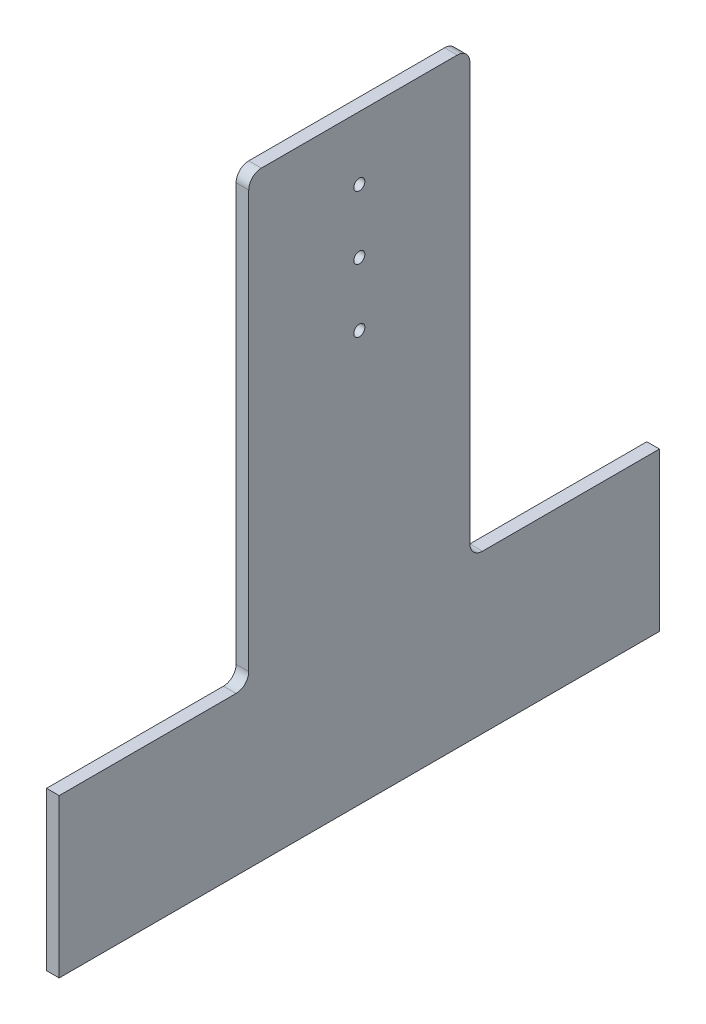
ISO-10303-21;
HEADER;
FILE_DESCRIPTION(('STEP AP214'),'2;1');
FILE_NAME('part.step','',(''),(''),'','','');
FILE_SCHEMA(('AUTOMOTIVE_DESIGN { 1 0 10303 214 1 1 1 1 }'));
ENDSEC;
DATA;
#1=APPLICATION_CONTEXT('core data for automotive mechanical design processes');
#2=APPLICATION_PROTOCOL_DEFINITION('international standard','automotive_design',2000,#1);
#3=PRODUCT_CONTEXT('',#1,'mechanical');
#4=PRODUCT('Part','Part','',(#3));
#5=PRODUCT_RELATED_PRODUCT_CATEGORY('part','',(#4));
#6=PRODUCT_DEFINITION_FORMATION('','',#4);
#7=PRODUCT_DEFINITION_CONTEXT('part definition',#1,'design');
#8=PRODUCT_DEFINITION('design','',#6,#7);
#9=PRODUCT_DEFINITION_SHAPE('','',#8);
#10=(LENGTH_UNIT() NAMED_UNIT(*) SI_UNIT(.MILLI.,.METRE.));
#11=(NAMED_UNIT(*) PLANE_ANGLE_UNIT() SI_UNIT($,.RADIAN.));
#12=(NAMED_UNIT(*) SI_UNIT($,.STERADIAN.) SOLID_ANGLE_UNIT());
#13=UNCERTAINTY_MEASURE_WITH_UNIT(LENGTH_MEASURE(1.E-05),#10,'distance_accuracy_value','');
#14=(GEOMETRIC_REPRESENTATION_CONTEXT(3) GLOBAL_UNCERTAINTY_ASSIGNED_CONTEXT((#13)) GLOBAL_UNIT_ASSIGNED_CONTEXT((#10,
#11,#12)) REPRESENTATION_CONTEXT('',''));
#15=CARTESIAN_POINT('',(0.,0.,0.));
#16=DIRECTION('',(0.,0.,1.));
#17=DIRECTION('',(1.,0.,0.));
#18=AXIS2_PLACEMENT_3D('',#15,#16,#17);
#19=CARTESIAN_POINT('',(4.,0.,0.));
#20=DIRECTION('',(1.,0.,0.));
#21=DIRECTION('',(0.,0.,-1.));
#22=AXIS2_PLACEMENT_3D('',#19,#20,#21);
#23=PLANE('',#22);
#24=CARTESIAN_POINT('',(4.,125.,-2.22142021339255E-13));
#25=DIRECTION('',(1.,0.,0.));
#26=DIRECTION('',(0.,0.,-1.));
#27=AXIS2_PLACEMENT_3D('',#24,#25,#26);
#28=CIRCLE('',#27,1.75);
#29=CARTESIAN_POINT('',(4.,125.,-1.75000000000022));
#30=VERTEX_POINT('',#29);
#31=EDGE_CURVE('E294',#30,#30,#28,.T.);
#32=ORIENTED_EDGE('',*,*,#31,.F.);
#33=EDGE_LOOP('',(#32));
#34=FACE_BOUND('',#33,.T.);
#35=DIRECTION('',(0.,1.,0.));
#36=VECTOR('',#35,1.);
#37=CARTESIAN_POINT('',(4.,165.,-35.));
#38=LINE('',#37,#36);
#39=CARTESIAN_POINT('',(4.,29.,-35.));
#40=VERTEX_POINT('',#39);
#41=CARTESIAN_POINT('',(4.,161.,-35.));
#42=VERTEX_POINT('',#41);
#43=EDGE_CURVE('E143',#40,#42,#38,.T.);
#44=ORIENTED_EDGE('',*,*,#43,.T.);
#45=CARTESIAN_POINT('',(4.,161.,-31.));
#46=DIRECTION('',(1.,0.,0.));
#47=DIRECTION('',(0.,0.,-1.));
#48=AXIS2_PLACEMENT_3D('',#45,#46,#47);
#49=CIRCLE('',#48,4.);
#50=CARTESIAN_POINT('',(4.,165.,-31.));
#51=VERTEX_POINT('',#50);
#52=EDGE_CURVE('E194',#42,#51,#49,.T.);
#53=ORIENTED_EDGE('',*,*,#52,.T.);
#54=DIRECTION('',(0.,0.,1.));
#55=VECTOR('',#54,1.);
#56=CARTESIAN_POINT('',(4.,165.,35.));
#57=LINE('',#56,#55);
#58=CARTESIAN_POINT('',(4.,165.,31.));
#59=VERTEX_POINT('',#58);
#60=EDGE_CURVE('E241',#51,#59,#57,.T.);
#61=ORIENTED_EDGE('',*,*,#60,.T.);
#62=CARTESIAN_POINT('',(4.,161.,31.));
#63=DIRECTION('',(1.,0.,0.));
#64=DIRECTION('',(0.,0.,-1.));
#65=AXIS2_PLACEMENT_3D('',#62,#63,#64);
#66=CIRCLE('',#65,4.);
#67=CARTESIAN_POINT('',(4.,161.,35.));
#68=VERTEX_POINT('',#67);
#69=EDGE_CURVE('E191',#59,#68,#66,.T.);
#70=ORIENTED_EDGE('',*,*,#69,.T.);
#71=DIRECTION('',(0.,-1.,0.));
#72=VECTOR('',#71,1.);
#73=CARTESIAN_POINT('',(4.,165.,35.));
#74=LINE('',#73,#72);
#75=CARTESIAN_POINT('',(4.,29.,35.));
#76=VERTEX_POINT('',#75);
#77=EDGE_CURVE('E236',#68,#76,#74,.T.);
#78=ORIENTED_EDGE('',*,*,#77,.T.);
#79=CARTESIAN_POINT('',(4.,29.,39.));
#80=DIRECTION('',(1.,0.,0.));
#81=DIRECTION('',(0.,0.,-1.));
#82=AXIS2_PLACEMENT_3D('',#79,#80,#81);
#83=CIRCLE('',#82,4.);
#84=CARTESIAN_POINT('',(4.,25.,39.));
#85=VERTEX_POINT('',#84);
#86=EDGE_CURVE('E11',#76,#85,#83,.F.);
#87=ORIENTED_EDGE('',*,*,#86,.T.);
#88=DIRECTION('',(0.,0.,1.));
#89=VECTOR('',#88,1.);
#90=CARTESIAN_POINT('',(4.,25.,94.9999999999999));
#91=LINE('',#90,#89);
#92=CARTESIAN_POINT('',(4.,25.,94.9999999999999));
#93=VERTEX_POINT('',#92);
#94=EDGE_CURVE('E232',#85,#93,#91,.T.);
#95=ORIENTED_EDGE('',*,*,#94,.T.);
#96=DIRECTION('',(0.,-1.,0.));
#97=VECTOR('',#96,1.);
#98=CARTESIAN_POINT('',(4.,25.,94.9999999999999));
#99=LINE('',#98,#97);
#100=CARTESIAN_POINT('',(4.,-25.,94.9999999999999));
#101=VERTEX_POINT('',#100);
#102=EDGE_CURVE('E235',#93,#101,#99,.T.);
#103=ORIENTED_EDGE('',*,*,#102,.T.);
#104=DIRECTION('',(0.,0.,-1.));
#105=VECTOR('',#104,1.);
#106=CARTESIAN_POINT('',(4.,-25.,94.9999999999999));
#107=LINE('',#106,#105);
#108=CARTESIAN_POINT('',(4.,-25.,-95.0000000000001));
#109=VERTEX_POINT('',#108);
#110=EDGE_CURVE('E150',#101,#109,#107,.T.);
#111=ORIENTED_EDGE('',*,*,#110,.T.);
#112=DIRECTION('',(0.,1.,0.));
#113=VECTOR('',#112,1.);
#114=CARTESIAN_POINT('',(4.,25.,-95.0000000000001));
#115=LINE('',#114,#113);
#116=CARTESIAN_POINT('',(4.,25.,-95.0000000000001));
#117=VERTEX_POINT('',#116);
#118=EDGE_CURVE('E144',#109,#117,#115,.T.);
#119=ORIENTED_EDGE('',*,*,#118,.T.);
#120=DIRECTION('',(0.,0.,1.));
#121=VECTOR('',#120,1.);
#122=CARTESIAN_POINT('',(4.,25.,-35.));
#123=LINE('',#122,#121);
#124=CARTESIAN_POINT('',(4.,25.,-39.));
#125=VERTEX_POINT('',#124);
#126=EDGE_CURVE('E132',#117,#125,#123,.T.);
#127=ORIENTED_EDGE('',*,*,#126,.T.);
#128=CARTESIAN_POINT('',(4.,29.,-39.));
#129=DIRECTION('',(1.,0.,0.));
#130=DIRECTION('',(0.,0.,-1.));
#131=AXIS2_PLACEMENT_3D('',#128,#129,#130);
#132=CIRCLE('',#131,4.);
#133=EDGE_CURVE('E210',#125,#40,#132,.F.);
#134=ORIENTED_EDGE('',*,*,#133,.T.);
#135=EDGE_LOOP('',(#44,#53,#61,#70,#78,#87,#95,#103,#111,#119,#127,#134));
#136=FACE_BOUND('',#135,.T.);
#137=CARTESIAN_POINT('',(4.,145.,0.));
#138=DIRECTION('',(1.,0.,0.));
#139=DIRECTION('',(0.,0.,-1.));
#140=AXIS2_PLACEMENT_3D('',#137,#138,#139);
#141=CIRCLE('',#140,1.75);
#142=CARTESIAN_POINT('',(4.,145.,-1.75000000000001));
#143=VERTEX_POINT('',#142);
#144=EDGE_CURVE('E251',#143,#143,#141,.T.);
#145=ORIENTED_EDGE('',*,*,#144,.F.);
#146=EDGE_LOOP('',(#145));
#147=FACE_BOUND('',#146,.T.);
#148=CARTESIAN_POINT('',(4.,105.,-4.30406254870696E-13));
#149=DIRECTION('',(1.,0.,0.));
#150=DIRECTION('',(0.,0.,-1.));
#151=AXIS2_PLACEMENT_3D('',#148,#149,#150);
#152=CIRCLE('',#151,1.75);
#153=CARTESIAN_POINT('',(4.,105.,-1.75000000000043));
#154=VERTEX_POINT('',#153);
#155=EDGE_CURVE('E302',#154,#154,#152,.T.);
#156=ORIENTED_EDGE('',*,*,#155,.F.);
#157=EDGE_LOOP('',(#156));
#158=FACE_BOUND('',#157,.T.);
#159=ADVANCED_FACE('F42',(#34,#136,#147,#158),#23,.T.);
#160=CARTESIAN_POINT('',(0.,0.,0.));
#161=DIRECTION('',(1.,0.,0.));
#162=DIRECTION('',(0.,0.,-1.));
#163=AXIS2_PLACEMENT_3D('',#160,#161,#162);
#164=PLANE('',#163);
#165=DIRECTION('',(0.,0.,1.));
#166=VECTOR('',#165,1.);
#167=CARTESIAN_POINT('',(0.,165.,35.));
#168=LINE('',#167,#166);
#169=CARTESIAN_POINT('',(0.,165.,-31.));
#170=VERTEX_POINT('',#169);
#171=CARTESIAN_POINT('',(0.,165.,31.));
#172=VERTEX_POINT('',#171);
#173=EDGE_CURVE('E227',#170,#172,#168,.T.);
#174=ORIENTED_EDGE('',*,*,#173,.F.);
#175=CARTESIAN_POINT('',(0.,161.,-31.));
#176=DIRECTION('',(1.,0.,0.));
#177=DIRECTION('',(0.,0.,-1.));
#178=AXIS2_PLACEMENT_3D('',#175,#176,#177);
#179=CIRCLE('',#178,4.);
#180=CARTESIAN_POINT('',(0.,161.,-35.));
#181=VERTEX_POINT('',#180);
#182=EDGE_CURVE('E188',#170,#181,#179,.F.);
#183=ORIENTED_EDGE('',*,*,#182,.T.);
#184=DIRECTION('',(0.,1.,0.));
#185=VECTOR('',#184,1.);
#186=CARTESIAN_POINT('',(0.,165.,-35.));
#187=LINE('',#186,#185);
#188=CARTESIAN_POINT('',(0.,29.,-35.));
#189=VERTEX_POINT('',#188);
#190=EDGE_CURVE('E254',#189,#181,#187,.T.);
#191=ORIENTED_EDGE('',*,*,#190,.F.);
#192=CARTESIAN_POINT('',(0.,29.,-39.));
#193=DIRECTION('',(1.,0.,0.));
#194=DIRECTION('',(0.,0.,-1.));
#195=AXIS2_PLACEMENT_3D('',#192,#193,#194);
#196=CIRCLE('',#195,4.);
#197=CARTESIAN_POINT('',(0.,25.,-39.));
#198=VERTEX_POINT('',#197);
#199=EDGE_CURVE('E207',#189,#198,#196,.T.);
#200=ORIENTED_EDGE('',*,*,#199,.T.);
#201=DIRECTION('',(0.,0.,1.));
#202=VECTOR('',#201,1.);
#203=CARTESIAN_POINT('',(0.,25.,-35.));
#204=LINE('',#203,#202);
#205=CARTESIAN_POINT('',(0.,25.,-95.0000000000001));
#206=VERTEX_POINT('',#205);
#207=EDGE_CURVE('E250',#206,#198,#204,.T.);
#208=ORIENTED_EDGE('',*,*,#207,.F.);
#209=DIRECTION('',(0.,1.,0.));
#210=VECTOR('',#209,1.);
#211=CARTESIAN_POINT('',(0.,25.,-95.0000000000001));
#212=LINE('',#211,#210);
#213=CARTESIAN_POINT('',(0.,-25.,-95.0000000000001));
#214=VERTEX_POINT('',#213);
#215=EDGE_CURVE('E159',#214,#206,#212,.T.);
#216=ORIENTED_EDGE('',*,*,#215,.F.);
#217=DIRECTION('',(0.,0.,-1.));
#218=VECTOR('',#217,1.);
#219=CARTESIAN_POINT('',(0.,-25.,94.9999999999999));
#220=LINE('',#219,#218);
#221=CARTESIAN_POINT('',(0.,-25.,94.9999999999999));
#222=VERTEX_POINT('',#221);
#223=EDGE_CURVE('E155',#222,#214,#220,.T.);
#224=ORIENTED_EDGE('',*,*,#223,.F.);
#225=DIRECTION('',(0.,-1.,0.));
#226=VECTOR('',#225,1.);
#227=CARTESIAN_POINT('',(0.,25.,94.9999999999999));
#228=LINE('',#227,#226);
#229=CARTESIAN_POINT('',(0.,25.,94.9999999999999));
#230=VERTEX_POINT('',#229);
#231=EDGE_CURVE('E263',#230,#222,#228,.T.);
#232=ORIENTED_EDGE('',*,*,#231,.F.);
#233=DIRECTION('',(0.,0.,1.));
#234=VECTOR('',#233,1.);
#235=CARTESIAN_POINT('',(0.,25.,94.9999999999999));
#236=LINE('',#235,#234);
#237=CARTESIAN_POINT('',(0.,25.,39.));
#238=VERTEX_POINT('',#237);
#239=EDGE_CURVE('E221',#238,#230,#236,.T.);
#240=ORIENTED_EDGE('',*,*,#239,.F.);
#241=CARTESIAN_POINT('',(0.,29.,39.));
#242=DIRECTION('',(1.,0.,0.));
#243=DIRECTION('',(0.,0.,-1.));
#244=AXIS2_PLACEMENT_3D('',#241,#242,#243);
#245=CIRCLE('',#244,4.);
#246=CARTESIAN_POINT('',(0.,29.,35.));
#247=VERTEX_POINT('',#246);
#248=EDGE_CURVE('E51',#238,#247,#245,.T.);
#249=ORIENTED_EDGE('',*,*,#248,.T.);
#250=DIRECTION('',(0.,-1.,0.));
#251=VECTOR('',#250,1.);
#252=CARTESIAN_POINT('',(0.,165.,35.));
#253=LINE('',#252,#251);
#254=CARTESIAN_POINT('',(0.,161.,35.));
#255=VERTEX_POINT('',#254);
#256=EDGE_CURVE('E219',#255,#247,#253,.T.);
#257=ORIENTED_EDGE('',*,*,#256,.F.);
#258=CARTESIAN_POINT('',(0.,161.,31.));
#259=DIRECTION('',(1.,0.,0.));
#260=DIRECTION('',(0.,0.,-1.));
#261=AXIS2_PLACEMENT_3D('',#258,#259,#260);
#262=CIRCLE('',#261,4.);
#263=EDGE_CURVE('E185',#255,#172,#262,.F.);
#264=ORIENTED_EDGE('',*,*,#263,.T.);
#265=EDGE_LOOP('',(#174,#183,#191,#200,#208,#216,#224,#232,#240,#249,#257,#264));
#266=FACE_BOUND('',#265,.T.);
#267=CARTESIAN_POINT('',(0.,145.,0.));
#268=DIRECTION('',(1.,0.,0.));
#269=DIRECTION('',(0.,0.,-1.));
#270=AXIS2_PLACEMENT_3D('',#267,#268,#269);
#271=CIRCLE('',#270,1.75);
#272=CARTESIAN_POINT('',(0.,145.,-1.75000000000001));
#273=VERTEX_POINT('',#272);
#274=EDGE_CURVE('E290',#273,#273,#271,.T.);
#275=ORIENTED_EDGE('',*,*,#274,.T.);
#276=EDGE_LOOP('',(#275));
#277=FACE_BOUND('',#276,.T.);
#278=CARTESIAN_POINT('',(0.,125.,-2.22142021339255E-13));
#279=DIRECTION('',(1.,0.,0.));
#280=DIRECTION('',(0.,0.,-1.));
#281=AXIS2_PLACEMENT_3D('',#278,#279,#280);
#282=CIRCLE('',#281,1.75);
#283=CARTESIAN_POINT('',(0.,125.,-1.75000000000022));
#284=VERTEX_POINT('',#283);
#285=EDGE_CURVE('E298',#284,#284,#282,.T.);
#286=ORIENTED_EDGE('',*,*,#285,.T.);
#287=EDGE_LOOP('',(#286));
#288=FACE_BOUND('',#287,.T.);
#289=CARTESIAN_POINT('',(0.,105.,-4.30406254870696E-13));
#290=DIRECTION('',(1.,0.,0.));
#291=DIRECTION('',(0.,0.,-1.));
#292=AXIS2_PLACEMENT_3D('',#289,#290,#291);
#293=CIRCLE('',#292,1.75);
#294=CARTESIAN_POINT('',(0.,105.,-1.75000000000043));
#295=VERTEX_POINT('',#294);
#296=EDGE_CURVE('E306',#295,#295,#293,.T.);
#297=ORIENTED_EDGE('',*,*,#296,.T.);
#298=EDGE_LOOP('',(#297));
#299=FACE_BOUND('',#298,.T.);
#300=ADVANCED_FACE('F217',(#266,#277,#288,#299),#164,.F.);
#301=CARTESIAN_POINT('',(4.,25.,-95.0000000000001));
#302=DIRECTION('',(0.,0.,1.));
#303=DIRECTION('',(1.,0.,0.));
#304=AXIS2_PLACEMENT_3D('',#301,#302,#303);
#305=PLANE('',#304);
#306=ORIENTED_EDGE('',*,*,#215,.T.);
#307=DIRECTION('',(-1.,0.,0.));
#308=VECTOR('',#307,1.);
#309=CARTESIAN_POINT('',(4.,25.,-95.0000000000001));
#310=LINE('',#309,#308);
#311=EDGE_CURVE('E137',#117,#206,#310,.T.);
#312=ORIENTED_EDGE('',*,*,#311,.F.);
#313=ORIENTED_EDGE('',*,*,#118,.F.);
#314=DIRECTION('',(-1.,0.,0.));
#315=VECTOR('',#314,1.);
#316=CARTESIAN_POINT('',(4.,-25.,-95.0000000000001));
#317=LINE('',#316,#315);
#318=EDGE_CURVE('E247',#109,#214,#317,.T.);
#319=ORIENTED_EDGE('',*,*,#318,.T.);
#320=EDGE_LOOP('',(#306,#312,#313,#319));
#321=FACE_BOUND('',#320,.T.);
#322=ADVANCED_FACE('F157',(#321),#305,.F.);
#323=CARTESIAN_POINT('',(4.,25.,-35.));
#324=DIRECTION('',(0.,-1.,0.));
#325=DIRECTION('',(0.,0.,-1.));
#326=AXIS2_PLACEMENT_3D('',#323,#324,#325);
#327=PLANE('',#326);
#328=ORIENTED_EDGE('',*,*,#207,.T.);
#329=DIRECTION('',(-1.,0.,0.));
#330=VECTOR('',#329,1.);
#331=CARTESIAN_POINT('',(4.,25.,-39.));
#332=LINE('',#331,#330);
#333=EDGE_CURVE('E140',#198,#125,#332,.F.);
#334=ORIENTED_EDGE('',*,*,#333,.T.);
#335=ORIENTED_EDGE('',*,*,#126,.F.);
#336=ORIENTED_EDGE('',*,*,#311,.T.);
#337=EDGE_LOOP('',(#328,#334,#335,#336));
#338=FACE_BOUND('',#337,.T.);
#339=ADVANCED_FACE('F135',(#338),#327,.F.);
#340=CARTESIAN_POINT('',(4.,165.,-35.));
#341=DIRECTION('',(0.,0.,1.));
#342=DIRECTION('',(0.,-1.,0.));
#343=AXIS2_PLACEMENT_3D('',#340,#341,#342);
#344=PLANE('',#343);
#345=ORIENTED_EDGE('',*,*,#43,.F.);
#346=DIRECTION('',(-1.,0.,0.));
#347=VECTOR('',#346,1.);
#348=CARTESIAN_POINT('',(0.,29.,-35.));
#349=LINE('',#348,#347);
#350=EDGE_CURVE('E166',#40,#189,#349,.T.);
#351=ORIENTED_EDGE('',*,*,#350,.T.);
#352=ORIENTED_EDGE('',*,*,#190,.T.);
#353=DIRECTION('',(-1.,0.,0.));
#354=VECTOR('',#353,1.);
#355=CARTESIAN_POINT('',(4.,161.,-35.));
#356=LINE('',#355,#354);
#357=EDGE_CURVE('E161',#181,#42,#356,.F.);
#358=ORIENTED_EDGE('',*,*,#357,.T.);
#359=EDGE_LOOP('',(#345,#351,#352,#358));
#360=FACE_BOUND('',#359,.T.);
#361=ADVANCED_FACE('F283',(#360),#344,.F.);
#362=CARTESIAN_POINT('',(4.,165.,35.));
#363=DIRECTION('',(0.,-1.,0.));
#364=DIRECTION('',(0.,0.,-1.));
#365=AXIS2_PLACEMENT_3D('',#362,#363,#364);
#366=PLANE('',#365);
#367=ORIENTED_EDGE('',*,*,#60,.F.);
#368=DIRECTION('',(-1.,0.,0.));
#369=VECTOR('',#368,1.);
#370=CARTESIAN_POINT('',(4.,165.,-31.));
#371=LINE('',#370,#369);
#372=EDGE_CURVE('E181',#51,#170,#371,.T.);
#373=ORIENTED_EDGE('',*,*,#372,.T.);
#374=ORIENTED_EDGE('',*,*,#173,.T.);
#375=DIRECTION('',(-1.,0.,0.));
#376=VECTOR('',#375,1.);
#377=CARTESIAN_POINT('',(4.,165.,31.));
#378=LINE('',#377,#376);
#379=EDGE_CURVE('E178',#172,#59,#378,.F.);
#380=ORIENTED_EDGE('',*,*,#379,.T.);
#381=EDGE_LOOP('',(#367,#373,#374,#380));
#382=FACE_BOUND('',#381,.T.);
#383=ADVANCED_FACE('F338',(#382),#366,.F.);
#384=CARTESIAN_POINT('',(4.,165.,35.));
#385=DIRECTION('',(0.,0.,-1.));
#386=DIRECTION('',(0.,1.,0.));
#387=AXIS2_PLACEMENT_3D('',#384,#385,#386);
#388=PLANE('',#387);
#389=ORIENTED_EDGE('',*,*,#77,.F.);
#390=DIRECTION('',(-1.,0.,0.));
#391=VECTOR('',#390,1.);
#392=CARTESIAN_POINT('',(4.,161.,35.));
#393=LINE('',#392,#391);
#394=EDGE_CURVE('E199',#68,#255,#393,.T.);
#395=ORIENTED_EDGE('',*,*,#394,.T.);
#396=ORIENTED_EDGE('',*,*,#256,.T.);
#397=DIRECTION('',(-1.,0.,0.));
#398=VECTOR('',#397,1.);
#399=CARTESIAN_POINT('',(4.,29.,35.));
#400=LINE('',#399,#398);
#401=EDGE_CURVE('E64',#247,#76,#400,.F.);
#402=ORIENTED_EDGE('',*,*,#401,.T.);
#403=EDGE_LOOP('',(#389,#395,#396,#402));
#404=FACE_BOUND('',#403,.T.);
#405=ADVANCED_FACE('F224',(#404),#388,.F.);
#406=CARTESIAN_POINT('',(4.,25.,94.9999999999999));
#407=DIRECTION('',(0.,-1.,0.));
#408=DIRECTION('',(0.,0.,-1.));
#409=AXIS2_PLACEMENT_3D('',#406,#407,#408);
#410=PLANE('',#409);
#411=ORIENTED_EDGE('',*,*,#94,.F.);
#412=DIRECTION('',(-1.,0.,0.));
#413=VECTOR('',#412,1.);
#414=CARTESIAN_POINT('',(0.,25.,39.));
#415=LINE('',#414,#413);
#416=EDGE_CURVE('E203',#85,#238,#415,.T.);
#417=ORIENTED_EDGE('',*,*,#416,.T.);
#418=ORIENTED_EDGE('',*,*,#239,.T.);
#419=DIRECTION('',(-1.,0.,0.));
#420=VECTOR('',#419,1.);
#421=CARTESIAN_POINT('',(4.,25.,94.9999999999999));
#422=LINE('',#421,#420);
#423=EDGE_CURVE('E162',#93,#230,#422,.T.);
#424=ORIENTED_EDGE('',*,*,#423,.F.);
#425=EDGE_LOOP('',(#411,#417,#418,#424));
#426=FACE_BOUND('',#425,.T.);
#427=ADVANCED_FACE('F230',(#426),#410,.F.);
#428=CARTESIAN_POINT('',(4.,25.,94.9999999999999));
#429=DIRECTION('',(0.,0.,-1.));
#430=DIRECTION('',(-1.,0.,0.));
#431=AXIS2_PLACEMENT_3D('',#428,#429,#430);
#432=PLANE('',#431);
#433=ORIENTED_EDGE('',*,*,#231,.T.);
#434=DIRECTION('',(-1.,0.,0.));
#435=VECTOR('',#434,1.);
#436=CARTESIAN_POINT('',(4.,-25.,94.9999999999999));
#437=LINE('',#436,#435);
#438=EDGE_CURVE('E169',#101,#222,#437,.T.);
#439=ORIENTED_EDGE('',*,*,#438,.F.);
#440=ORIENTED_EDGE('',*,*,#102,.F.);
#441=ORIENTED_EDGE('',*,*,#423,.T.);
#442=EDGE_LOOP('',(#433,#439,#440,#441));
#443=FACE_BOUND('',#442,.T.);
#444=ADVANCED_FACE('F331',(#443),#432,.F.);
#445=CARTESIAN_POINT('',(4.,-25.,94.9999999999999));
#446=DIRECTION('',(0.,1.,0.));
#447=DIRECTION('',(0.,0.,1.));
#448=AXIS2_PLACEMENT_3D('',#445,#446,#447);
#449=PLANE('',#448);
#450=ORIENTED_EDGE('',*,*,#223,.T.);
#451=ORIENTED_EDGE('',*,*,#318,.F.);
#452=ORIENTED_EDGE('',*,*,#110,.F.);
#453=ORIENTED_EDGE('',*,*,#438,.T.);
#454=EDGE_LOOP('',(#450,#451,#452,#453));
#455=FACE_BOUND('',#454,.T.);
#456=ADVANCED_FACE('F274',(#455),#449,.F.);
#457=CARTESIAN_POINT('',(4.,145.,0.));
#458=DIRECTION('',(-1.,0.,0.));
#459=DIRECTION('',(0.,0.,1.));
#460=AXIS2_PLACEMENT_3D('',#457,#458,#459);
#461=CYLINDRICAL_SURFACE('',#460,1.75);
#462=ORIENTED_EDGE('',*,*,#144,.T.);
#463=EDGE_LOOP('',(#462));
#464=FACE_BOUND('',#463,.T.);
#465=ORIENTED_EDGE('',*,*,#274,.F.);
#466=EDGE_LOOP('',(#465));
#467=FACE_BOUND('',#466,.T.);
#468=ADVANCED_FACE('F326',(#464,#467),#461,.F.);
#469=CARTESIAN_POINT('',(4.,125.,-2.22142021339255E-13));
#470=DIRECTION('',(-1.,0.,0.));
#471=DIRECTION('',(0.,0.,1.));
#472=AXIS2_PLACEMENT_3D('',#469,#470,#471);
#473=CYLINDRICAL_SURFACE('',#472,1.75);
#474=ORIENTED_EDGE('',*,*,#31,.T.);
#475=EDGE_LOOP('',(#474));
#476=FACE_BOUND('',#475,.T.);
#477=ORIENTED_EDGE('',*,*,#285,.F.);
#478=EDGE_LOOP('',(#477));
#479=FACE_BOUND('',#478,.T.);
#480=ADVANCED_FACE('F443',(#476,#479),#473,.F.);
#481=CARTESIAN_POINT('',(4.,105.,-4.30406254870696E-13));
#482=DIRECTION('',(-1.,0.,0.));
#483=DIRECTION('',(0.,0.,1.));
#484=AXIS2_PLACEMENT_3D('',#481,#482,#483);
#485=CYLINDRICAL_SURFACE('',#484,1.75);
#486=ORIENTED_EDGE('',*,*,#155,.T.);
#487=EDGE_LOOP('',(#486));
#488=FACE_BOUND('',#487,.T.);
#489=ORIENTED_EDGE('',*,*,#296,.F.);
#490=EDGE_LOOP('',(#489));
#491=FACE_BOUND('',#490,.T.);
#492=ADVANCED_FACE('F314',(#488,#491),#485,.F.);
#493=CARTESIAN_POINT('',(4.,29.,-39.));
#494=DIRECTION('',(1.,0.,0.));
#495=DIRECTION('',(0.,0.,-1.));
#496=AXIS2_PLACEMENT_3D('',#493,#494,#495);
#497=CYLINDRICAL_SURFACE('',#496,4.);
#498=ORIENTED_EDGE('',*,*,#133,.F.);
#499=ORIENTED_EDGE('',*,*,#333,.F.);
#500=ORIENTED_EDGE('',*,*,#199,.F.);
#501=ORIENTED_EDGE('',*,*,#350,.F.);
#502=EDGE_LOOP('',(#498,#499,#500,#501));
#503=FACE_BOUND('',#502,.T.);
#504=ADVANCED_FACE('F278',(#503),#497,.F.);
#505=CARTESIAN_POINT('',(4.,161.,-31.));
#506=DIRECTION('',(-1.,0.,0.));
#507=DIRECTION('',(0.,0.,1.));
#508=AXIS2_PLACEMENT_3D('',#505,#506,#507);
#509=CYLINDRICAL_SURFACE('',#508,4.);
#510=ORIENTED_EDGE('',*,*,#52,.F.);
#511=ORIENTED_EDGE('',*,*,#357,.F.);
#512=ORIENTED_EDGE('',*,*,#182,.F.);
#513=ORIENTED_EDGE('',*,*,#372,.F.);
#514=EDGE_LOOP('',(#510,#511,#512,#513));
#515=FACE_BOUND('',#514,.T.);
#516=ADVANCED_FACE('F350',(#515),#509,.T.);
#517=CARTESIAN_POINT('',(4.,161.,31.));
#518=DIRECTION('',(-1.,0.,0.));
#519=DIRECTION('',(0.,0.,1.));
#520=AXIS2_PLACEMENT_3D('',#517,#518,#519);
#521=CYLINDRICAL_SURFACE('',#520,4.);
#522=ORIENTED_EDGE('',*,*,#69,.F.);
#523=ORIENTED_EDGE('',*,*,#379,.F.);
#524=ORIENTED_EDGE('',*,*,#263,.F.);
#525=ORIENTED_EDGE('',*,*,#394,.F.);
#526=EDGE_LOOP('',(#522,#523,#524,#525));
#527=FACE_BOUND('',#526,.T.);
#528=ADVANCED_FACE('F352',(#527),#521,.T.);
#529=CARTESIAN_POINT('',(4.,29.,39.));
#530=DIRECTION('',(1.,0.,0.));
#531=DIRECTION('',(0.,0.,-1.));
#532=AXIS2_PLACEMENT_3D('',#529,#530,#531);
#533=CYLINDRICAL_SURFACE('',#532,4.);
#534=ORIENTED_EDGE('',*,*,#86,.F.);
#535=ORIENTED_EDGE('',*,*,#401,.F.);
#536=ORIENTED_EDGE('',*,*,#248,.F.);
#537=ORIENTED_EDGE('',*,*,#416,.F.);
#538=EDGE_LOOP('',(#534,#535,#536,#537));
#539=FACE_BOUND('',#538,.T.);
#540=ADVANCED_FACE('F44',(#539),#533,.F.);
#541=CLOSED_SHELL('',(#159,#300,#322,#339,#361,#383,#405,#427,#444,#456,#468,#480,#492,#504,
#516,#528,#540));
#542=MANIFOLD_SOLID_BREP('B2',#541);
#543=ADVANCED_BREP_SHAPE_REPRESENTATION('',(#18,#542),#14);
#544=SHAPE_DEFINITION_REPRESENTATION(#9,#543);
ENDSEC;
END-ISO-10303-21;
